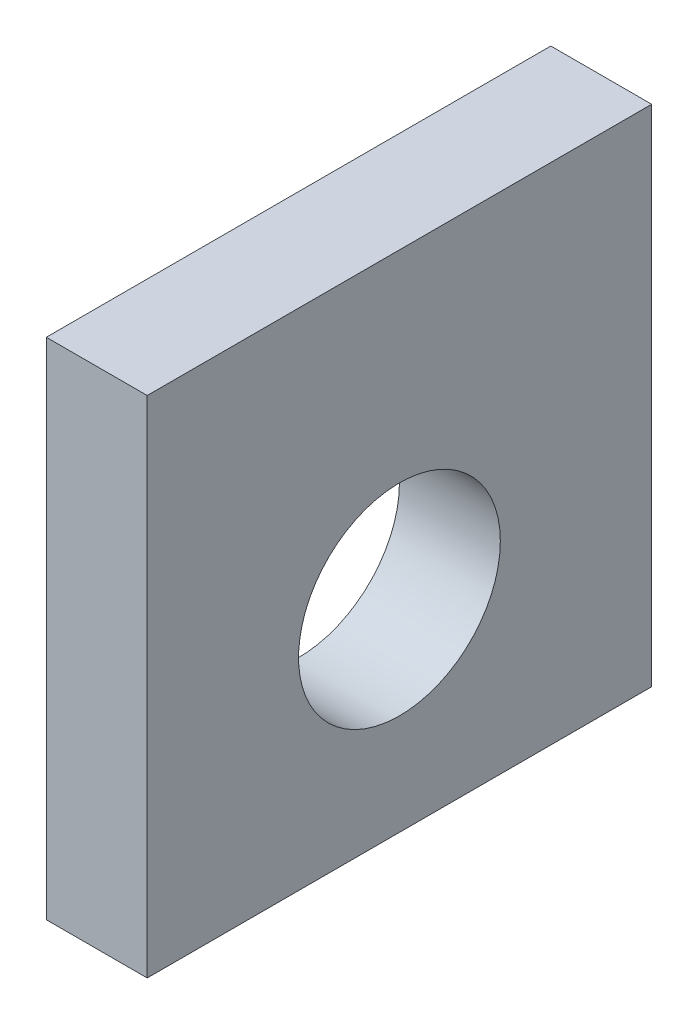
ISO-10303-21;
HEADER;
FILE_DESCRIPTION(('STEP AP214'),'2;1');
FILE_NAME('part.step','',(''),(''),'','','');
FILE_SCHEMA(('AUTOMOTIVE_DESIGN { 1 0 10303 214 1 1 1 1 }'));
ENDSEC;
DATA;
#1=APPLICATION_CONTEXT('core data for automotive mechanical design processes');
#2=APPLICATION_PROTOCOL_DEFINITION('international standard','automotive_design',2000,#1);
#3=PRODUCT_CONTEXT('',#1,'mechanical');
#4=PRODUCT('Part','Part','',(#3));
#5=PRODUCT_RELATED_PRODUCT_CATEGORY('part','',(#4));
#6=PRODUCT_DEFINITION_FORMATION('','',#4);
#7=PRODUCT_DEFINITION_CONTEXT('part definition',#1,'design');
#8=PRODUCT_DEFINITION('design','',#6,#7);
#9=PRODUCT_DEFINITION_SHAPE('','',#8);
#10=(LENGTH_UNIT() NAMED_UNIT(*) SI_UNIT(.MILLI.,.METRE.));
#11=(NAMED_UNIT(*) PLANE_ANGLE_UNIT() SI_UNIT($,.RADIAN.));
#12=(NAMED_UNIT(*) SI_UNIT($,.STERADIAN.) SOLID_ANGLE_UNIT());
#13=UNCERTAINTY_MEASURE_WITH_UNIT(LENGTH_MEASURE(1.E-05),#10,'distance_accuracy_value','');
#14=(GEOMETRIC_REPRESENTATION_CONTEXT(3) GLOBAL_UNCERTAINTY_ASSIGNED_CONTEXT((#13)) GLOBAL_UNIT_ASSIGNED_CONTEXT((#10,
#11,#12)) REPRESENTATION_CONTEXT('',''));
#15=CARTESIAN_POINT('',(0.,0.,0.));
#16=DIRECTION('',(0.,0.,1.));
#17=DIRECTION('',(1.,0.,0.));
#18=AXIS2_PLACEMENT_3D('',#15,#16,#17);
#19=CARTESIAN_POINT('',(3.175,7.9375,7.9375));
#20=DIRECTION('',(0.,0.,-1.));
#21=DIRECTION('',(0.,1.,0.));
#22=AXIS2_PLACEMENT_3D('',#19,#20,#21);
#23=PLANE('',#22);
#24=DIRECTION('',(0.,-1.,0.));
#25=VECTOR('',#24,1.);
#26=CARTESIAN_POINT('',(0.,7.9375,7.9375));
#27=LINE('',#26,#25);
#28=CARTESIAN_POINT('',(0.,7.9375,7.9375));
#29=VERTEX_POINT('',#28);
#30=CARTESIAN_POINT('',(0.,-7.9375,7.9375));
#31=VERTEX_POINT('',#30);
#32=EDGE_CURVE('E104',#29,#31,#27,.T.);
#33=ORIENTED_EDGE('',*,*,#32,.T.);
#34=DIRECTION('',(-1.,0.,0.));
#35=VECTOR('',#34,1.);
#36=CARTESIAN_POINT('',(3.175,-7.9375,7.9375));
#37=LINE('',#36,#35);
#38=CARTESIAN_POINT('',(3.175,-7.9375,7.9375));
#39=VERTEX_POINT('',#38);
#40=EDGE_CURVE('E11',#39,#31,#37,.T.);
#41=ORIENTED_EDGE('',*,*,#40,.F.);
#42=DIRECTION('',(0.,-1.,0.));
#43=VECTOR('',#42,1.);
#44=CARTESIAN_POINT('',(3.175,7.9375,7.9375));
#45=LINE('',#44,#43);
#46=CARTESIAN_POINT('',(3.175,7.9375,7.9375));
#47=VERTEX_POINT('',#46);
#48=EDGE_CURVE('E92',#47,#39,#45,.T.);
#49=ORIENTED_EDGE('',*,*,#48,.F.);
#50=DIRECTION('',(-1.,0.,0.));
#51=VECTOR('',#50,1.);
#52=CARTESIAN_POINT('',(3.175,7.9375,7.9375));
#53=LINE('',#52,#51);
#54=EDGE_CURVE('E100',#47,#29,#53,.T.);
#55=ORIENTED_EDGE('',*,*,#54,.T.);
#56=EDGE_LOOP('',(#33,#41,#49,#55));
#57=FACE_BOUND('',#56,.T.);
#58=ADVANCED_FACE('F41',(#57),#23,.F.);
#59=CARTESIAN_POINT('',(3.175,-7.9375,7.9375));
#60=DIRECTION('',(0.,1.,0.));
#61=DIRECTION('',(0.,0.,1.));
#62=AXIS2_PLACEMENT_3D('',#59,#60,#61);
#63=PLANE('',#62);
#64=DIRECTION('',(0.,0.,-1.));
#65=VECTOR('',#64,1.);
#66=CARTESIAN_POINT('',(0.,-7.9375,7.9375));
#67=LINE('',#66,#65);
#68=CARTESIAN_POINT('',(0.,-7.9375,-7.9375));
#69=VERTEX_POINT('',#68);
#70=EDGE_CURVE('E96',#31,#69,#67,.T.);
#71=ORIENTED_EDGE('',*,*,#70,.T.);
#72=DIRECTION('',(-1.,0.,0.));
#73=VECTOR('',#72,1.);
#74=CARTESIAN_POINT('',(3.175,-7.9375,-7.9375));
#75=LINE('',#74,#73);
#76=CARTESIAN_POINT('',(3.175,-7.9375,-7.9375));
#77=VERTEX_POINT('',#76);
#78=EDGE_CURVE('E49',#77,#69,#75,.T.);
#79=ORIENTED_EDGE('',*,*,#78,.F.);
#80=DIRECTION('',(0.,0.,-1.));
#81=VECTOR('',#80,1.);
#82=CARTESIAN_POINT('',(3.175,-7.9375,7.9375));
#83=LINE('',#82,#81);
#84=EDGE_CURVE('E87',#39,#77,#83,.T.);
#85=ORIENTED_EDGE('',*,*,#84,.F.);
#86=ORIENTED_EDGE('',*,*,#40,.T.);
#87=EDGE_LOOP('',(#71,#79,#85,#86));
#88=FACE_BOUND('',#87,.T.);
#89=ADVANCED_FACE('F95',(#88),#63,.F.);
#90=CARTESIAN_POINT('',(3.175,7.9375,-7.9375));
#91=DIRECTION('',(0.,0.,1.));
#92=DIRECTION('',(1.,0.,0.));
#93=AXIS2_PLACEMENT_3D('',#90,#91,#92);
#94=PLANE('',#93);
#95=DIRECTION('',(0.,1.,0.));
#96=VECTOR('',#95,1.);
#97=CARTESIAN_POINT('',(0.,7.9375,-7.9375));
#98=LINE('',#97,#96);
#99=CARTESIAN_POINT('',(0.,7.9375,-7.9375));
#100=VERTEX_POINT('',#99);
#101=EDGE_CURVE('E74',#69,#100,#98,.T.);
#102=ORIENTED_EDGE('',*,*,#101,.T.);
#103=DIRECTION('',(-1.,0.,0.));
#104=VECTOR('',#103,1.);
#105=CARTESIAN_POINT('',(3.175,7.9375,-7.9375));
#106=LINE('',#105,#104);
#107=CARTESIAN_POINT('',(3.175,7.9375,-7.9375));
#108=VERTEX_POINT('',#107);
#109=EDGE_CURVE('E97',#108,#100,#106,.T.);
#110=ORIENTED_EDGE('',*,*,#109,.F.);
#111=DIRECTION('',(0.,1.,0.));
#112=VECTOR('',#111,1.);
#113=CARTESIAN_POINT('',(3.175,7.9375,-7.9375));
#114=LINE('',#113,#112);
#115=EDGE_CURVE('E90',#77,#108,#114,.T.);
#116=ORIENTED_EDGE('',*,*,#115,.F.);
#117=ORIENTED_EDGE('',*,*,#78,.T.);
#118=EDGE_LOOP('',(#102,#110,#116,#117));
#119=FACE_BOUND('',#118,.T.);
#120=ADVANCED_FACE('F98',(#119),#94,.F.);
#121=CARTESIAN_POINT('',(3.175,7.9375,7.9375));
#122=DIRECTION('',(0.,-1.,0.));
#123=DIRECTION('',(0.,0.,-1.));
#124=AXIS2_PLACEMENT_3D('',#121,#122,#123);
#125=PLANE('',#124);
#126=DIRECTION('',(0.,0.,1.));
#127=VECTOR('',#126,1.);
#128=CARTESIAN_POINT('',(0.,7.9375,7.9375));
#129=LINE('',#128,#127);
#130=EDGE_CURVE('E80',#100,#29,#129,.T.);
#131=ORIENTED_EDGE('',*,*,#130,.T.);
#132=ORIENTED_EDGE('',*,*,#54,.F.);
#133=DIRECTION('',(0.,0.,1.));
#134=VECTOR('',#133,1.);
#135=CARTESIAN_POINT('',(3.175,7.9375,7.9375));
#136=LINE('',#135,#134);
#137=EDGE_CURVE('E57',#108,#47,#136,.T.);
#138=ORIENTED_EDGE('',*,*,#137,.F.);
#139=ORIENTED_EDGE('',*,*,#109,.T.);
#140=EDGE_LOOP('',(#131,#132,#138,#139));
#141=FACE_BOUND('',#140,.T.);
#142=ADVANCED_FACE('F112',(#141),#125,.F.);
#143=CARTESIAN_POINT('',(3.175,0.,0.));
#144=DIRECTION('',(1.,0.,0.));
#145=DIRECTION('',(0.,0.,-1.));
#146=AXIS2_PLACEMENT_3D('',#143,#144,#145);
#147=PLANE('',#146);
#148=CARTESIAN_POINT('',(3.175,-1.5875,0.));
#149=DIRECTION('',(1.,0.,0.));
#150=DIRECTION('',(0.,0.,-1.));
#151=AXIS2_PLACEMENT_3D('',#148,#149,#150);
#152=CIRCLE('',#151,3.175);
#153=CARTESIAN_POINT('',(3.175,-1.5875,-3.175));
#154=VERTEX_POINT('',#153);
#155=EDGE_CURVE('E120',#154,#154,#152,.T.);
#156=ORIENTED_EDGE('',*,*,#155,.F.);
#157=EDGE_LOOP('',(#156));
#158=FACE_BOUND('',#157,.T.);
#159=ORIENTED_EDGE('',*,*,#48,.T.);
#160=ORIENTED_EDGE('',*,*,#84,.T.);
#161=ORIENTED_EDGE('',*,*,#115,.T.);
#162=ORIENTED_EDGE('',*,*,#137,.T.);
#163=EDGE_LOOP('',(#159,#160,#161,#162));
#164=FACE_BOUND('',#163,.T.);
#165=ADVANCED_FACE('F88',(#158,#164),#147,.T.);
#166=CARTESIAN_POINT('',(0.,0.,0.));
#167=DIRECTION('',(1.,0.,0.));
#168=DIRECTION('',(0.,0.,-1.));
#169=AXIS2_PLACEMENT_3D('',#166,#167,#168);
#170=PLANE('',#169);
#171=CARTESIAN_POINT('',(0.,-1.5875,0.));
#172=DIRECTION('',(1.,0.,0.));
#173=DIRECTION('',(0.,0.,-1.));
#174=AXIS2_PLACEMENT_3D('',#171,#172,#173);
#175=CIRCLE('',#174,3.175);
#176=CARTESIAN_POINT('',(0.,-1.5875,-3.175));
#177=VERTEX_POINT('',#176);
#178=EDGE_CURVE('E107',#177,#177,#175,.F.);
#179=ORIENTED_EDGE('',*,*,#178,.F.);
#180=EDGE_LOOP('',(#179));
#181=FACE_BOUND('',#180,.T.);
#182=ORIENTED_EDGE('',*,*,#32,.F.);
#183=ORIENTED_EDGE('',*,*,#130,.F.);
#184=ORIENTED_EDGE('',*,*,#101,.F.);
#185=ORIENTED_EDGE('',*,*,#70,.F.);
#186=EDGE_LOOP('',(#182,#183,#184,#185));
#187=FACE_BOUND('',#186,.T.);
#188=ADVANCED_FACE('F115',(#181,#187),#170,.F.);
#189=CARTESIAN_POINT('',(-0.00100000000000013,-1.5875,0.));
#190=DIRECTION('',(1.,0.,0.));
#191=DIRECTION('',(0.,0.,-1.));
#192=AXIS2_PLACEMENT_3D('',#189,#190,#191);
#193=CYLINDRICAL_SURFACE('',#192,3.175);
#194=ORIENTED_EDGE('',*,*,#155,.T.);
#195=EDGE_LOOP('',(#194));
#196=FACE_BOUND('',#195,.T.);
#197=ORIENTED_EDGE('',*,*,#178,.T.);
#198=EDGE_LOOP('',(#197));
#199=FACE_BOUND('',#198,.T.);
#200=ADVANCED_FACE('F124',(#196,#199),#193,.F.);
#201=CLOSED_SHELL('',(#58,#89,#120,#142,#165,#188,#200));
#202=MANIFOLD_SOLID_BREP('B2',#201);
#203=ADVANCED_BREP_SHAPE_REPRESENTATION('',(#18,#202),#14);
#204=SHAPE_DEFINITION_REPRESENTATION(#9,#203);
ENDSEC;
END-ISO-10303-21;
